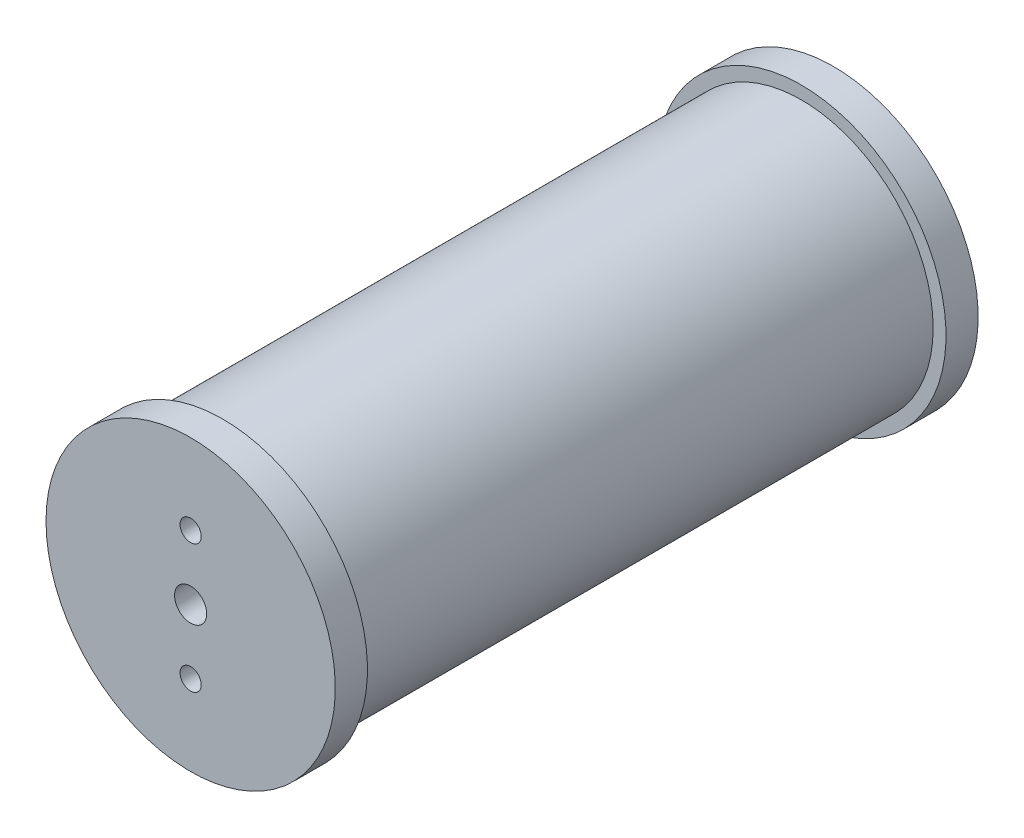
ISO-10303-21;
HEADER;
FILE_DESCRIPTION(('STEP AP214'),'2;1');
FILE_NAME('part.step','',(''),(''),'','','');
FILE_SCHEMA(('AUTOMOTIVE_DESIGN { 1 0 10303 214 1 1 1 1 }'));
ENDSEC;
DATA;
#1=APPLICATION_CONTEXT('core data for automotive mechanical design processes');
#2=APPLICATION_PROTOCOL_DEFINITION('international standard','automotive_design',2000,#1);
#3=PRODUCT_CONTEXT('',#1,'mechanical');
#4=PRODUCT('Part','Part','',(#3));
#5=PRODUCT_RELATED_PRODUCT_CATEGORY('part','',(#4));
#6=PRODUCT_DEFINITION_FORMATION('','',#4);
#7=PRODUCT_DEFINITION_CONTEXT('part definition',#1,'design');
#8=PRODUCT_DEFINITION('design','',#6,#7);
#9=PRODUCT_DEFINITION_SHAPE('','',#8);
#10=(LENGTH_UNIT() NAMED_UNIT(*) SI_UNIT(.MILLI.,.METRE.));
#11=(NAMED_UNIT(*) PLANE_ANGLE_UNIT() SI_UNIT($,.RADIAN.));
#12=(NAMED_UNIT(*) SI_UNIT($,.STERADIAN.) SOLID_ANGLE_UNIT());
#13=UNCERTAINTY_MEASURE_WITH_UNIT(LENGTH_MEASURE(1.E-05),#10,'distance_accuracy_value','');
#14=(GEOMETRIC_REPRESENTATION_CONTEXT(3) GLOBAL_UNCERTAINTY_ASSIGNED_CONTEXT((#13)) GLOBAL_UNIT_ASSIGNED_CONTEXT((#10,
#11,#12)) REPRESENTATION_CONTEXT('',''));
#15=CARTESIAN_POINT('',(0.,0.,0.));
#16=DIRECTION('',(0.,0.,1.));
#17=DIRECTION('',(1.,0.,0.));
#18=AXIS2_PLACEMENT_3D('',#15,#16,#17);
#19=CARTESIAN_POINT('',(0.,10.,79.9999999999272));
#20=DIRECTION('',(0.,0.,1.));
#21=DIRECTION('',(1.,0.,0.));
#22=AXIS2_PLACEMENT_3D('',#19,#20,#21);
#23=CONICAL_SURFACE('',#22,1.64999999992688,1.02974425864054);
#24=CARTESIAN_POINT('',(-2.27373675443232E-10,10.,79.0085799785345));
#25=VERTEX_POINT('',#24);
#26=VERTEX_LOOP('',#25);
#27=FACE_BOUND('',#26,.T.);
#28=CARTESIAN_POINT('',(0.,10.,80.));
#29=DIRECTION('',(0.,0.,1.));
#30=DIRECTION('',(1.,0.,0.));
#31=AXIS2_PLACEMENT_3D('',#28,#29,#30);
#32=CIRCLE('',#31,1.65);
#33=CARTESIAN_POINT('',(1.65,10.,80.));
#34=VERTEX_POINT('',#33);
#35=EDGE_CURVE('E37',#34,#34,#32,.T.);
#36=ORIENTED_EDGE('',*,*,#35,.T.);
#37=EDGE_LOOP('',(#36));
#38=FACE_BOUND('',#37,.T.);
#39=ADVANCED_FACE('F17',(#27,#38),#23,.F.);
#40=CARTESIAN_POINT('',(0.,-10.,79.9999999999272));
#41=DIRECTION('',(0.,0.,1.));
#42=DIRECTION('',(1.,0.,0.));
#43=AXIS2_PLACEMENT_3D('',#40,#41,#42);
#44=CONICAL_SURFACE('',#43,1.64999999992688,1.02974425864054);
#45=CARTESIAN_POINT('',(-2.27373675443232E-10,-10.,79.0085799785345));
#46=VERTEX_POINT('',#45);
#47=VERTEX_LOOP('',#46);
#48=FACE_BOUND('',#47,.T.);
#49=CARTESIAN_POINT('',(0.,-10.,80.));
#50=DIRECTION('',(0.,0.,1.));
#51=DIRECTION('',(1.,0.,0.));
#52=AXIS2_PLACEMENT_3D('',#49,#50,#51);
#53=CIRCLE('',#52,1.65);
#54=CARTESIAN_POINT('',(1.65,-10.,80.));
#55=VERTEX_POINT('',#54);
#56=EDGE_CURVE('E39',#55,#55,#53,.T.);
#57=ORIENTED_EDGE('',*,*,#56,.T.);
#58=EDGE_LOOP('',(#57));
#59=FACE_BOUND('',#58,.T.);
#60=ADVANCED_FACE('F34',(#48,#59),#44,.F.);
#61=CARTESIAN_POINT('',(0.,10.,100.));
#62=DIRECTION('',(0.,0.,1.));
#63=DIRECTION('',(1.,0.,0.));
#64=AXIS2_PLACEMENT_3D('',#61,#62,#63);
#65=CYLINDRICAL_SURFACE('',#64,1.65);
#66=CARTESIAN_POINT('',(0.,10.,100.));
#67=DIRECTION('',(0.,0.,1.));
#68=DIRECTION('',(1.,0.,0.));
#69=AXIS2_PLACEMENT_3D('',#66,#67,#68);
#70=CIRCLE('',#69,1.65);
#71=CARTESIAN_POINT('',(1.65,10.,100.));
#72=VERTEX_POINT('',#71);
#73=EDGE_CURVE('E63',#72,#72,#70,.F.);
#74=ORIENTED_EDGE('',*,*,#73,.F.);
#75=EDGE_LOOP('',(#74));
#76=FACE_BOUND('',#75,.T.);
#77=ORIENTED_EDGE('',*,*,#35,.F.);
#78=EDGE_LOOP('',(#77));
#79=FACE_BOUND('',#78,.T.);
#80=ADVANCED_FACE('F116',(#76,#79),#65,.F.);
#81=CARTESIAN_POINT('',(0.,-10.,100.));
#82=DIRECTION('',(0.,0.,1.));
#83=DIRECTION('',(1.,0.,0.));
#84=AXIS2_PLACEMENT_3D('',#81,#82,#83);
#85=CYLINDRICAL_SURFACE('',#84,1.65);
#86=CARTESIAN_POINT('',(0.,-10.,100.));
#87=DIRECTION('',(0.,0.,1.));
#88=DIRECTION('',(1.,0.,0.));
#89=AXIS2_PLACEMENT_3D('',#86,#87,#88);
#90=CIRCLE('',#89,1.65);
#91=CARTESIAN_POINT('',(1.65,-10.,100.));
#92=VERTEX_POINT('',#91);
#93=EDGE_CURVE('E61',#92,#92,#90,.F.);
#94=ORIENTED_EDGE('',*,*,#93,.F.);
#95=EDGE_LOOP('',(#94));
#96=FACE_BOUND('',#95,.T.);
#97=ORIENTED_EDGE('',*,*,#56,.F.);
#98=EDGE_LOOP('',(#97));
#99=FACE_BOUND('',#98,.T.);
#100=ADVANCED_FACE('F112',(#96,#99),#85,.F.);
#101=CARTESIAN_POINT('',(0.,0.,100.));
#102=DIRECTION('',(0.,0.,-1.));
#103=DIRECTION('',(-1.,0.,0.));
#104=AXIS2_PLACEMENT_3D('',#101,#102,#103);
#105=CYLINDRICAL_SURFACE('',#104,2.5);
#106=CARTESIAN_POINT('',(0.,0.,100.));
#107=DIRECTION('',(0.,0.,-1.));
#108=DIRECTION('',(-1.,0.,0.));
#109=AXIS2_PLACEMENT_3D('',#106,#107,#108);
#110=CIRCLE('',#109,2.5);
#111=CARTESIAN_POINT('',(-2.5,0.,100.));
#112=VERTEX_POINT('',#111);
#113=EDGE_CURVE('E58',#112,#112,#110,.T.);
#114=ORIENTED_EDGE('',*,*,#113,.F.);
#115=EDGE_LOOP('',(#114));
#116=FACE_BOUND('',#115,.T.);
#117=CARTESIAN_POINT('',(0.,0.,0.));
#118=DIRECTION('',(0.,0.,-1.));
#119=DIRECTION('',(-1.,0.,0.));
#120=AXIS2_PLACEMENT_3D('',#117,#118,#119);
#121=CIRCLE('',#120,2.5);
#122=CARTESIAN_POINT('',(-2.5,0.,0.));
#123=VERTEX_POINT('',#122);
#124=EDGE_CURVE('E20',#123,#123,#121,.T.);
#125=ORIENTED_EDGE('',*,*,#124,.T.);
#126=EDGE_LOOP('',(#125));
#127=FACE_BOUND('',#126,.T.);
#128=ADVANCED_FACE('F70',(#116,#127),#105,.F.);
#129=CARTESIAN_POINT('',(0.,0.,0.));
#130=DIRECTION('',(0.,0.,1.));
#131=DIRECTION('',(1.,0.,0.));
#132=AXIS2_PLACEMENT_3D('',#129,#130,#131);
#133=PLANE('',#132);
#134=ORIENTED_EDGE('',*,*,#124,.F.);
#135=EDGE_LOOP('',(#134));
#136=FACE_BOUND('',#135,.T.);
#137=CARTESIAN_POINT('',(0.,0.,0.));
#138=DIRECTION('',(0.,0.,-1.));
#139=DIRECTION('',(-1.,0.,0.));
#140=AXIS2_PLACEMENT_3D('',#137,#138,#139);
#141=CIRCLE('',#140,22.5);
#142=CARTESIAN_POINT('',(-22.5,0.,0.));
#143=VERTEX_POINT('',#142);
#144=EDGE_CURVE('E55',#143,#143,#141,.F.);
#145=ORIENTED_EDGE('',*,*,#144,.F.);
#146=EDGE_LOOP('',(#145));
#147=FACE_BOUND('',#146,.T.);
#148=ADVANCED_FACE('F72',(#136,#147),#133,.F.);
#149=CARTESIAN_POINT('',(0.,0.,100.));
#150=DIRECTION('',(0.,0.,1.));
#151=DIRECTION('',(1.,0.,0.));
#152=AXIS2_PLACEMENT_3D('',#149,#150,#151);
#153=PLANE('',#152);
#154=ORIENTED_EDGE('',*,*,#113,.T.);
#155=EDGE_LOOP('',(#154));
#156=FACE_BOUND('',#155,.T.);
#157=CARTESIAN_POINT('',(0.,0.,100.));
#158=DIRECTION('',(0.,0.,-1.));
#159=DIRECTION('',(-1.,0.,0.));
#160=AXIS2_PLACEMENT_3D('',#157,#158,#159);
#161=CIRCLE('',#160,22.5);
#162=CARTESIAN_POINT('',(-22.5,0.,100.));
#163=VERTEX_POINT('',#162);
#164=EDGE_CURVE('E52',#163,#163,#161,.T.);
#165=ORIENTED_EDGE('',*,*,#164,.F.);
#166=EDGE_LOOP('',(#165));
#167=FACE_BOUND('',#166,.T.);
#168=ORIENTED_EDGE('',*,*,#93,.T.);
#169=EDGE_LOOP('',(#168));
#170=FACE_BOUND('',#169,.T.);
#171=ORIENTED_EDGE('',*,*,#73,.T.);
#172=EDGE_LOOP('',(#171));
#173=FACE_BOUND('',#172,.T.);
#174=ADVANCED_FACE('F75',(#156,#167,#170,#173),#153,.T.);
#175=CARTESIAN_POINT('',(0.,0.,100.));
#176=DIRECTION('',(0.,0.,-1.));
#177=DIRECTION('',(-1.,0.,0.));
#178=AXIS2_PLACEMENT_3D('',#175,#176,#177);
#179=CYLINDRICAL_SURFACE('',#178,22.5);
#180=ORIENTED_EDGE('',*,*,#144,.T.);
#181=EDGE_LOOP('',(#180));
#182=FACE_BOUND('',#181,.T.);
#183=CARTESIAN_POINT('',(0.,0.,5.));
#184=DIRECTION('',(0.,0.,-1.));
#185=DIRECTION('',(-1.,0.,0.));
#186=AXIS2_PLACEMENT_3D('',#183,#184,#185);
#187=CIRCLE('',#186,22.5);
#188=CARTESIAN_POINT('',(-22.5,0.,5.));
#189=VERTEX_POINT('',#188);
#190=EDGE_CURVE('E49',#189,#189,#187,.F.);
#191=ORIENTED_EDGE('',*,*,#190,.F.);
#192=EDGE_LOOP('',(#191));
#193=FACE_BOUND('',#192,.T.);
#194=ADVANCED_FACE('F79',(#182,#193),#179,.T.);
#195=CARTESIAN_POINT('',(0.,0.,100.));
#196=DIRECTION('',(0.,0.,-1.));
#197=DIRECTION('',(-1.,0.,0.));
#198=AXIS2_PLACEMENT_3D('',#195,#196,#197);
#199=CYLINDRICAL_SURFACE('',#198,22.5);
#200=ORIENTED_EDGE('',*,*,#164,.T.);
#201=EDGE_LOOP('',(#200));
#202=FACE_BOUND('',#201,.T.);
#203=CARTESIAN_POINT('',(0.,0.,95.));
#204=DIRECTION('',(0.,0.,-1.));
#205=DIRECTION('',(-1.,0.,0.));
#206=AXIS2_PLACEMENT_3D('',#203,#204,#205);
#207=CIRCLE('',#206,22.5);
#208=CARTESIAN_POINT('',(-22.5,0.,95.));
#209=VERTEX_POINT('',#208);
#210=EDGE_CURVE('E46',#209,#209,#207,.F.);
#211=ORIENTED_EDGE('',*,*,#210,.T.);
#212=EDGE_LOOP('',(#211));
#213=FACE_BOUND('',#212,.T.);
#214=ADVANCED_FACE('F82',(#202,#213),#199,.T.);
#215=CARTESIAN_POINT('',(0.,0.,5.));
#216=DIRECTION('',(0.,0.,1.));
#217=DIRECTION('',(1.,0.,0.));
#218=AXIS2_PLACEMENT_3D('',#215,#216,#217);
#219=PLANE('',#218);
#220=ORIENTED_EDGE('',*,*,#190,.T.);
#221=EDGE_LOOP('',(#220));
#222=FACE_BOUND('',#221,.T.);
#223=CARTESIAN_POINT('',(0.,0.,5.));
#224=DIRECTION('',(0.,0.,1.));
#225=DIRECTION('',(1.,0.,0.));
#226=AXIS2_PLACEMENT_3D('',#223,#224,#225);
#227=CIRCLE('',#226,20.5);
#228=CARTESIAN_POINT('',(20.5,0.,5.));
#229=VERTEX_POINT('',#228);
#230=EDGE_CURVE('E26',#229,#229,#227,.T.);
#231=ORIENTED_EDGE('',*,*,#230,.F.);
#232=EDGE_LOOP('',(#231));
#233=FACE_BOUND('',#232,.T.);
#234=ADVANCED_FACE('F86',(#222,#233),#219,.T.);
#235=CARTESIAN_POINT('',(0.,0.,95.));
#236=DIRECTION('',(0.,0.,1.));
#237=DIRECTION('',(1.,0.,0.));
#238=AXIS2_PLACEMENT_3D('',#235,#236,#237);
#239=PLANE('',#238);
#240=ORIENTED_EDGE('',*,*,#210,.F.);
#241=EDGE_LOOP('',(#240));
#242=FACE_BOUND('',#241,.T.);
#243=CARTESIAN_POINT('',(0.,0.,95.));
#244=DIRECTION('',(0.,0.,1.));
#245=DIRECTION('',(1.,0.,0.));
#246=AXIS2_PLACEMENT_3D('',#243,#244,#245);
#247=CIRCLE('',#246,20.5);
#248=CARTESIAN_POINT('',(20.5,0.,95.));
#249=VERTEX_POINT('',#248);
#250=EDGE_CURVE('E11',#249,#249,#247,.F.);
#251=ORIENTED_EDGE('',*,*,#250,.F.);
#252=EDGE_LOOP('',(#251));
#253=FACE_BOUND('',#252,.T.);
#254=ADVANCED_FACE('F89',(#242,#253),#239,.F.);
#255=CARTESIAN_POINT('',(0.,0.,5.));
#256=DIRECTION('',(0.,0.,1.));
#257=DIRECTION('',(1.,0.,0.));
#258=AXIS2_PLACEMENT_3D('',#255,#256,#257);
#259=CYLINDRICAL_SURFACE('',#258,20.5);
#260=ORIENTED_EDGE('',*,*,#250,.T.);
#261=EDGE_LOOP('',(#260));
#262=FACE_BOUND('',#261,.T.);
#263=ORIENTED_EDGE('',*,*,#230,.T.);
#264=EDGE_LOOP('',(#263));
#265=FACE_BOUND('',#264,.T.);
#266=ADVANCED_FACE('F93',(#262,#265),#259,.T.);
#267=CLOSED_SHELL('',(#39,#60,#80,#100,#128,#148,#174,#194,#214,#234,#254,#266));
#268=MANIFOLD_SOLID_BREP('B1',#267);
#269=ADVANCED_BREP_SHAPE_REPRESENTATION('',(#18,#268),#14);
#270=SHAPE_DEFINITION_REPRESENTATION(#9,#269);
ENDSEC;
END-ISO-10303-21;
